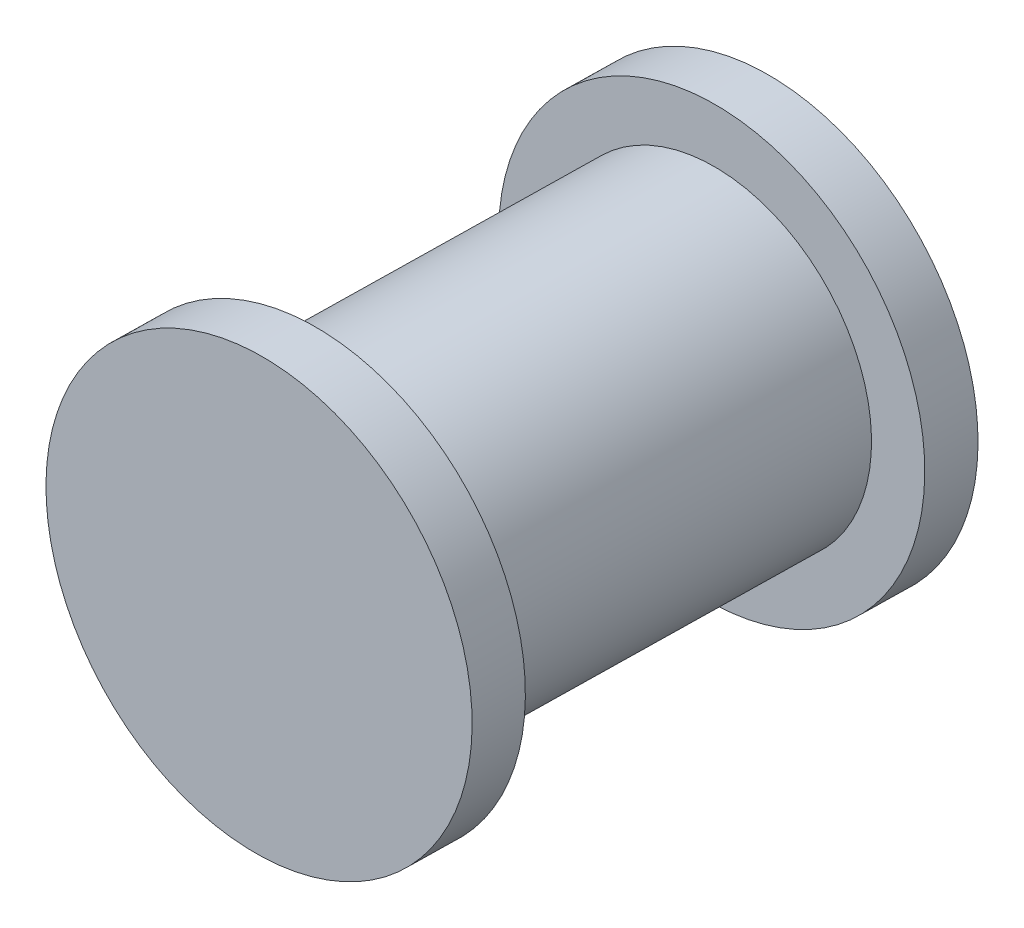
ISO-10303-21;
HEADER;
FILE_DESCRIPTION(('STEP AP214'),'2;1');
FILE_NAME('part.step','',(''),(''),'','','');
FILE_SCHEMA(('AUTOMOTIVE_DESIGN { 1 0 10303 214 1 1 1 1 }'));
ENDSEC;
DATA;
#1=APPLICATION_CONTEXT('core data for automotive mechanical design processes');
#2=APPLICATION_PROTOCOL_DEFINITION('international standard','automotive_design',2000,#1);
#3=PRODUCT_CONTEXT('',#1,'mechanical');
#4=PRODUCT('Part','Part','',(#3));
#5=PRODUCT_RELATED_PRODUCT_CATEGORY('part','',(#4));
#6=PRODUCT_DEFINITION_FORMATION('','',#4);
#7=PRODUCT_DEFINITION_CONTEXT('part definition',#1,'design');
#8=PRODUCT_DEFINITION('design','',#6,#7);
#9=PRODUCT_DEFINITION_SHAPE('','',#8);
#10=(LENGTH_UNIT() NAMED_UNIT(*) SI_UNIT(.MILLI.,.METRE.));
#11=(NAMED_UNIT(*) PLANE_ANGLE_UNIT() SI_UNIT($,.RADIAN.));
#12=(NAMED_UNIT(*) SI_UNIT($,.STERADIAN.) SOLID_ANGLE_UNIT());
#13=UNCERTAINTY_MEASURE_WITH_UNIT(LENGTH_MEASURE(1.E-05),#10,'distance_accuracy_value','');
#14=(GEOMETRIC_REPRESENTATION_CONTEXT(3) GLOBAL_UNCERTAINTY_ASSIGNED_CONTEXT((#13)) GLOBAL_UNIT_ASSIGNED_CONTEXT((#10,
#11,#12)) REPRESENTATION_CONTEXT('',''));
#15=CARTESIAN_POINT('',(0.,0.,0.));
#16=DIRECTION('',(0.,0.,1.));
#17=DIRECTION('',(1.,0.,0.));
#18=AXIS2_PLACEMENT_3D('',#15,#16,#17);
#19=CARTESIAN_POINT('',(-3.31646168860722E-12,2.87844237431514,-6.92912424034663));
#20=DIRECTION('',(4.78159178918247E-13,0.0174524064370392,0.999847695156396));
#21=DIRECTION('',(1.,0.,-4.78200812281671E-13));
#22=AXIS2_PLACEMENT_3D('',#19,#20,#21);
#23=PLANE('',#22);
#24=CARTESIAN_POINT('',(-3.34985945232846E-12,6.87783315494072,-6.99893386609478));
#25=DIRECTION('',(-4.78159178918247E-13,-0.0174524064370392,-0.999847695156396));
#26=DIRECTION('',(-1.,0.,4.78200812281671E-13));
#27=AXIS2_PLACEMENT_3D('',#24,#25,#26);
#28=CIRCLE('',#27,4.);
#29=CARTESIAN_POINT('',(-4.00000000000335,6.87783315494072,-6.99893386609287));
#30=VERTEX_POINT('',#29);
#31=EDGE_CURVE('E53',#30,#30,#28,.T.);
#32=ORIENTED_EDGE('',*,*,#31,.T.);
#33=EDGE_LOOP('',(#32));
#34=FACE_BOUND('',#33,.T.);
#35=ADVANCED_FACE('F31',(#34),#23,.F.);
#36=CARTESIAN_POINT('',(1.19265274739489E-12,7.0436310160926,2.49961923789097));
#37=DIRECTION('',(-4.78159178918247E-13,-0.0174524064370392,-0.999847695156396));
#38=DIRECTION('',(-1.,0.,4.78200812281671E-13));
#39=AXIS2_PLACEMENT_3D('',#36,#37,#38);
#40=PLANE('',#39);
#41=CARTESIAN_POINT('',(1.19265274739489E-12,7.0436310160926,2.49961923789097));
#42=DIRECTION('',(-4.78159178918247E-13,-0.0174524064370392,-0.999847695156396));
#43=DIRECTION('',(-1.,0.,4.78200812281671E-13));
#44=AXIS2_PLACEMENT_3D('',#41,#42,#43);
#45=CIRCLE('',#44,4.);
#46=CARTESIAN_POINT('',(-3.99999999999881,7.0436310160926,2.49961923789289));
#47=VERTEX_POINT('',#46);
#48=EDGE_CURVE('E10',#47,#47,#45,.T.);
#49=ORIENTED_EDGE('',*,*,#48,.F.);
#50=EDGE_LOOP('',(#49));
#51=FACE_BOUND('',#50,.T.);
#52=ADVANCED_FACE('F83',(#51),#40,.F.);
#53=CARTESIAN_POINT('',(-3.34985945232846E-12,6.87783315494072,-6.99893386609478));
#54=DIRECTION('',(-4.78159178918247E-13,-0.0174524064370392,-0.999847695156396));
#55=DIRECTION('',(-1.,0.,4.78200812281671E-13));
#56=AXIS2_PLACEMENT_3D('',#53,#54,#55);
#57=CYLINDRICAL_SURFACE('',#56,4.);
#58=CARTESIAN_POINT('',(7.14493568476637E-13,7.02617860965556,1.49977154273458));
#59=DIRECTION('',(-4.78159178918247E-13,-0.0174524064370392,-0.999847695156396));
#60=DIRECTION('',(-1.,0.,4.78200812281671E-13));
#61=AXIS2_PLACEMENT_3D('',#58,#59,#60);
#62=CIRCLE('',#61,4.);
#63=CARTESIAN_POINT('',(-3.99999999999929,7.02617860965556,1.49977154273649));
#64=VERTEX_POINT('',#63);
#65=EDGE_CURVE('E37',#64,#64,#62,.T.);
#66=ORIENTED_EDGE('',*,*,#65,.F.);
#67=EDGE_LOOP('',(#66));
#68=FACE_BOUND('',#67,.T.);
#69=ORIENTED_EDGE('',*,*,#48,.T.);
#70=EDGE_LOOP('',(#69));
#71=FACE_BOUND('',#70,.T.);
#72=ADVANCED_FACE('F78',(#68,#71),#57,.T.);
#73=CARTESIAN_POINT('',(7.47891332197881E-13,3.02678782902997,1.56958116848274));
#74=DIRECTION('',(4.78159178918247E-13,0.0174524064370392,0.999847695156396));
#75=DIRECTION('',(1.,0.,-4.78200812281671E-13));
#76=AXIS2_PLACEMENT_3D('',#73,#74,#75);
#77=PLANE('',#76);
#78=CARTESIAN_POINT('',(7.14493568476637E-13,7.02617860965556,1.49977154273458));
#79=DIRECTION('',(-4.78159178918247E-13,-0.0174524064370392,-0.999847695156396));
#80=DIRECTION('',(-1.,0.,4.78200812281671E-13));
#81=AXIS2_PLACEMENT_3D('',#78,#79,#80);
#82=CIRCLE('',#81,3.);
#83=CARTESIAN_POINT('',(-2.99999999999929,7.02617860965556,1.49977154273601));
#84=VERTEX_POINT('',#83);
#85=EDGE_CURVE('E41',#84,#84,#82,.T.);
#86=ORIENTED_EDGE('',*,*,#85,.F.);
#87=EDGE_LOOP('',(#86));
#88=FACE_BOUND('',#87,.T.);
#89=ORIENTED_EDGE('',*,*,#65,.T.);
#90=EDGE_LOOP('',(#89));
#91=FACE_BOUND('',#90,.T.);
#92=ADVANCED_FACE('F73',(#88,#91),#77,.F.);
#93=CARTESIAN_POINT('',(-3.34985945232846E-12,6.87783315494072,-6.99893386609478));
#94=DIRECTION('',(-4.78159178918247E-13,-0.0174524064370392,-0.999847695156396));
#95=DIRECTION('',(-1.,0.,4.78200812281671E-13));
#96=AXIS2_PLACEMENT_3D('',#93,#94,#95);
#97=CYLINDRICAL_SURFACE('',#96,3.);
#98=CARTESIAN_POINT('',(-2.87170027341022E-12,6.89528556137776,-5.99908617093839));
#99=DIRECTION('',(-4.78159178918247E-13,-0.0174524064370392,-0.999847695156396));
#100=DIRECTION('',(-1.,0.,4.78200812281671E-13));
#101=AXIS2_PLACEMENT_3D('',#98,#99,#100);
#102=CIRCLE('',#101,3.);
#103=CARTESIAN_POINT('',(-3.00000000000287,6.89528556137776,-5.99908617093695));
#104=VERTEX_POINT('',#103);
#105=EDGE_CURVE('E45',#104,#104,#102,.T.);
#106=ORIENTED_EDGE('',*,*,#105,.F.);
#107=EDGE_LOOP('',(#106));
#108=FACE_BOUND('',#107,.T.);
#109=ORIENTED_EDGE('',*,*,#85,.T.);
#110=EDGE_LOOP('',(#109));
#111=FACE_BOUND('',#110,.T.);
#112=ADVANCED_FACE('F67',(#108,#111),#97,.T.);
#113=CARTESIAN_POINT('',(-2.84665195061928E-12,3.89574247590858,-5.94672895162727));
#114=DIRECTION('',(-4.78159178918247E-13,-0.0174524064370392,-0.999847695156396));
#115=DIRECTION('',(-1.,0.,4.78200812281671E-13));
#116=AXIS2_PLACEMENT_3D('',#113,#114,#115);
#117=PLANE('',#116);
#118=CARTESIAN_POINT('',(-2.87170027341022E-12,6.89528556137776,-5.99908617093839));
#119=DIRECTION('',(-4.78159178918247E-13,-0.0174524064370392,-0.999847695156396));
#120=DIRECTION('',(-1.,0.,4.78200812281671E-13));
#121=AXIS2_PLACEMENT_3D('',#118,#119,#120);
#122=CIRCLE('',#121,4.);
#123=CARTESIAN_POINT('',(-4.00000000000287,6.89528556137776,-5.99908617093647));
#124=VERTEX_POINT('',#123);
#125=EDGE_CURVE('E50',#124,#124,#122,.T.);
#126=ORIENTED_EDGE('',*,*,#125,.F.);
#127=EDGE_LOOP('',(#126));
#128=FACE_BOUND('',#127,.T.);
#129=ORIENTED_EDGE('',*,*,#105,.T.);
#130=EDGE_LOOP('',(#129));
#131=FACE_BOUND('',#130,.T.);
#132=ADVANCED_FACE('F61',(#128,#131),#117,.F.);
#133=CARTESIAN_POINT('',(-3.34985945232846E-12,6.87783315494072,-6.99893386609478));
#134=DIRECTION('',(-4.78159178918247E-13,-0.0174524064370392,-0.999847695156396));
#135=DIRECTION('',(-1.,0.,4.78200812281671E-13));
#136=AXIS2_PLACEMENT_3D('',#133,#134,#135);
#137=CYLINDRICAL_SURFACE('',#136,4.);
#138=ORIENTED_EDGE('',*,*,#31,.F.);
#139=EDGE_LOOP('',(#138));
#140=FACE_BOUND('',#139,.T.);
#141=ORIENTED_EDGE('',*,*,#125,.T.);
#142=EDGE_LOOP('',(#141));
#143=FACE_BOUND('',#142,.T.);
#144=ADVANCED_FACE('F58',(#140,#143),#137,.T.);
#145=CLOSED_SHELL('',(#35,#52,#72,#92,#112,#132,#144));
#146=MANIFOLD_SOLID_BREP('B2',#145);
#147=ADVANCED_BREP_SHAPE_REPRESENTATION('',(#18,#146),#14);
#148=SHAPE_DEFINITION_REPRESENTATION(#9,#147);
ENDSEC;
END-ISO-10303-21;
